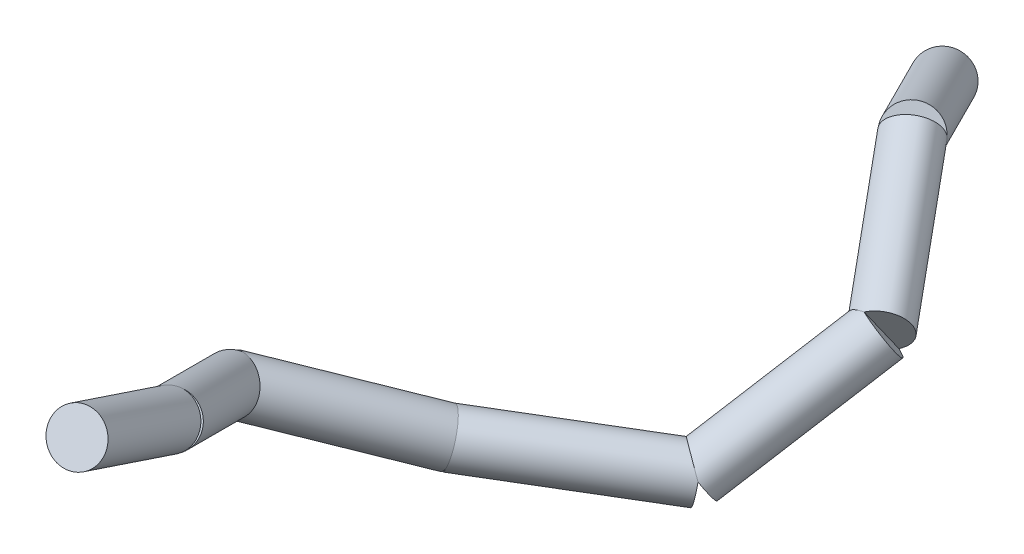
ISO-10303-21;
HEADER;
FILE_DESCRIPTION(('STEP AP214'),'2;1');
FILE_NAME('part.step','',(''),(''),'','','');
FILE_SCHEMA(('AUTOMOTIVE_DESIGN { 1 0 10303 214 1 1 1 1 }'));
ENDSEC;
DATA;
#1=APPLICATION_CONTEXT('core data for automotive mechanical design processes');
#2=APPLICATION_PROTOCOL_DEFINITION('international standard','automotive_design',2000,#1);
#3=PRODUCT_CONTEXT('',#1,'mechanical');
#4=PRODUCT('Part','Part','',(#3));
#5=PRODUCT_RELATED_PRODUCT_CATEGORY('part','',(#4));
#6=PRODUCT_DEFINITION_FORMATION('','',#4);
#7=PRODUCT_DEFINITION_CONTEXT('part definition',#1,'design');
#8=PRODUCT_DEFINITION('design','',#6,#7);
#9=PRODUCT_DEFINITION_SHAPE('','',#8);
#10=(LENGTH_UNIT() NAMED_UNIT(*) SI_UNIT(.MILLI.,.METRE.));
#11=(NAMED_UNIT(*) PLANE_ANGLE_UNIT() SI_UNIT($,.RADIAN.));
#12=(NAMED_UNIT(*) SI_UNIT($,.STERADIAN.) SOLID_ANGLE_UNIT());
#13=UNCERTAINTY_MEASURE_WITH_UNIT(LENGTH_MEASURE(1.E-05),#10,'distance_accuracy_value','');
#14=(GEOMETRIC_REPRESENTATION_CONTEXT(3) GLOBAL_UNCERTAINTY_ASSIGNED_CONTEXT((#13)) GLOBAL_UNIT_ASSIGNED_CONTEXT((#10,
#11,#12)) REPRESENTATION_CONTEXT('',''));
#15=CARTESIAN_POINT('',(0.,0.,0.));
#16=DIRECTION('',(0.,0.,1.));
#17=DIRECTION('',(1.,0.,0.));
#18=AXIS2_PLACEMENT_3D('',#15,#16,#17);
#19=CARTESIAN_POINT('',(0.,0.,0.));
#20=DIRECTION('',(0.557086014531156,0.371390676354103,0.742781352708207));
#21=DIRECTION('',(0.554700196225229,-0.832050294337844,0.));
#22=AXIS2_PLACEMENT_3D('',#19,#20,#21);
#23=PLANE('',#22);
#24=CARTESIAN_POINT('',(0.,0.,0.));
#25=DIRECTION('',(0.557086014531003,0.371390676354126,0.742781352708311));
#26=DIRECTION('',(0.821925551875018,-0.118716298750003,-0.557086014531012));
#27=AXIS2_PLACEMENT_3D('',#24,#25,#26);
#28=CIRCLE('',#27,8.);
#29=CARTESIAN_POINT('',(6.575404414999,-0.94973039,-4.456688116249));
#30=VERTEX_POINT('',#29);
#31=EDGE_CURVE('E10',#30,#30,#28,.T.);
#32=ORIENTED_EDGE('',*,*,#31,.F.);
#33=EDGE_LOOP('',(#32));
#34=FACE_BOUND('',#33,.T.);
#35=ADVANCED_FACE('F16',(#34),#23,.F.);
#36=CARTESIAN_POINT('',(30.,20.,40.));
#37=DIRECTION('',(0.557086014531156,0.371390676354103,0.742781352708207));
#38=DIRECTION('',(0.554700196225229,-0.832050294337844,0.));
#39=AXIS2_PLACEMENT_3D('',#36,#37,#38);
#40=PLANE('',#39);
#41=DIRECTION('',(0.8,0.,-0.6));
#42=VECTOR('',#41,1.);
#43=CARTESIAN_POINT('',(30.,20.,40.));
#44=LINE('',#43,#42);
#45=CARTESIAN_POINT('',(23.6,20.,44.8));
#46=VERTEX_POINT('',#45);
#47=CARTESIAN_POINT('',(36.4,20.,35.2));
#48=VERTEX_POINT('',#47);
#49=EDGE_CURVE('E208',#46,#48,#44,.T.);
#50=ORIENTED_EDGE('',*,*,#49,.T.);
#51=CARTESIAN_POINT('',(30.,20.,40.));
#52=DIRECTION('',(0.557086014531003,0.371390676354126,0.742781352708311));
#53=DIRECTION('',(0.821925551875018,-0.118716298750003,-0.557086014531012));
#54=AXIS2_PLACEMENT_3D('',#51,#52,#53);
#55=CIRCLE('',#54,8.);
#56=EDGE_CURVE('E42',#48,#46,#55,.T.);
#57=ORIENTED_EDGE('',*,*,#56,.T.);
#58=EDGE_LOOP('',(#50,#57));
#59=FACE_BOUND('',#58,.T.);
#60=ADVANCED_FACE('F318',(#59),#40,.T.);
#61=CARTESIAN_POINT('',(0.,0.,0.));
#62=DIRECTION('',(0.557086014531003,0.371390676354126,0.742781352708311));
#63=DIRECTION('',(0.821925551875018,-0.118716298750003,-0.557086014531012));
#64=AXIS2_PLACEMENT_3D('',#61,#62,#63);
#65=CYLINDRICAL_SURFACE('',#64,8.);
#66=ORIENTED_EDGE('',*,*,#56,.F.);
#67=CARTESIAN_POINT('',(30.,20.,40.));
#68=DIRECTION('',(0.6,0.,0.8));
#69=DIRECTION('',(0.,1.,0.));
#70=AXIS2_PLACEMENT_3D('',#67,#68,#69);
#71=ELLIPSE('',#70,8.616263691415,8.);
#72=CARTESIAN_POINT('',(36.347469121399,18.898312747599,35.23939815895));
#73=VERTEX_POINT('',#72);
#74=EDGE_CURVE('E180',#73,#48,#71,.T.);
#75=ORIENTED_EDGE('',*,*,#74,.F.);
#76=DIRECTION('',(0.557086014531156,0.371390676354103,0.742781352708207));
#77=VECTOR('',#76,1.);
#78=CARTESIAN_POINT('',(6.575404414999,-0.94973039,-4.456688116249));
#79=LINE('',#78,#77);
#80=EDGE_CURVE('E24',#30,#73,#79,.T.);
#81=ORIENTED_EDGE('',*,*,#80,.F.);
#82=ORIENTED_EDGE('',*,*,#31,.T.);
#83=ORIENTED_EDGE('',*,*,#80,.T.);
#84=CARTESIAN_POINT('',(30.,20.,40.));
#85=DIRECTION('',(0.6,0.,0.8));
#86=DIRECTION('',(0.,1.,0.));
#87=AXIS2_PLACEMENT_3D('',#84,#85,#86);
#88=ELLIPSE('',#87,8.616263691415,8.);
#89=EDGE_CURVE('E201',#46,#73,#88,.T.);
#90=ORIENTED_EDGE('',*,*,#89,.F.);
#91=EDGE_LOOP('',(#66,#75,#81,#82,#83,#90));
#92=FACE_BOUND('',#91,.T.);
#93=ADVANCED_FACE('F307',(#92),#65,.T.);
#94=CARTESIAN_POINT('',(30.,20.,40.));
#95=DIRECTION('',(0.557086014531156,-0.371390676354103,0.742781352708207));
#96=DIRECTION('',(-0.554700196225229,-0.832050294337844,0.));
#97=AXIS2_PLACEMENT_3D('',#94,#95,#96);
#98=PLANE('',#97);
#99=ORIENTED_EDGE('',*,*,#49,.F.);
#100=CARTESIAN_POINT('',(30.,20.,40.));
#101=DIRECTION('',(0.557086014531003,-0.371390676354126,0.742781352708311));
#102=DIRECTION('',(0.821925551875018,0.118716298750003,-0.557086014531012));
#103=AXIS2_PLACEMENT_3D('',#100,#101,#102);
#104=CIRCLE('',#103,8.);
#105=CARTESIAN_POINT('',(36.575404414999,20.94973039,35.543311883751));
#106=VERTEX_POINT('',#105);
#107=EDGE_CURVE('E204',#106,#46,#104,.T.);
#108=ORIENTED_EDGE('',*,*,#107,.F.);
#109=CARTESIAN_POINT('',(30.,20.,40.));
#110=DIRECTION('',(0.557086014531003,-0.371390676354126,0.742781352708311));
#111=DIRECTION('',(0.821925551875018,0.118716298750003,-0.557086014531012));
#112=AXIS2_PLACEMENT_3D('',#109,#110,#111);
#113=CIRCLE('',#112,8.);
#114=EDGE_CURVE('E176',#48,#106,#113,.T.);
#115=ORIENTED_EDGE('',*,*,#114,.F.);
#116=EDGE_LOOP('',(#99,#108,#115));
#117=FACE_BOUND('',#116,.T.);
#118=ADVANCED_FACE('F316',(#117),#98,.F.);
#119=CARTESIAN_POINT('',(60.,0.,80.));
#120=DIRECTION('',(0.557086014531156,-0.371390676354103,0.742781352708207));
#121=DIRECTION('',(-0.554700196225229,-0.832050294337844,0.));
#122=AXIS2_PLACEMENT_3D('',#119,#120,#121);
#123=PLANE('',#122);
#124=CARTESIAN_POINT('',(60.,0.,80.));
#125=DIRECTION('',(0.557086014531003,-0.371390676354126,0.742781352708311));
#126=DIRECTION('',(0.821925551875018,0.118716298750003,-0.557086014531012));
#127=AXIS2_PLACEMENT_3D('',#124,#125,#126);
#128=CIRCLE('',#127,8.);
#129=CARTESIAN_POINT('',(61.323037168951,-6.615185844758,75.700129200907));
#130=VERTEX_POINT('',#129);
#131=CARTESIAN_POINT('',(66.575404414999,0.94973039,75.543311883751));
#132=VERTEX_POINT('',#131);
#133=EDGE_CURVE('E179',#130,#132,#128,.T.);
#134=ORIENTED_EDGE('',*,*,#133,.T.);
#135=CARTESIAN_POINT('',(60.,0.,80.));
#136=DIRECTION('',(0.557086014531003,-0.371390676354126,0.742781352708311));
#137=DIRECTION('',(0.821925551875018,0.118716298750003,-0.557086014531012));
#138=AXIS2_PLACEMENT_3D('',#135,#136,#137);
#139=CIRCLE('',#138,8.);
#140=CARTESIAN_POINT('',(58.676962831049,6.615185844758,84.299870799093));
#141=VERTEX_POINT('',#140);
#142=EDGE_CURVE('E194',#132,#141,#139,.T.);
#143=ORIENTED_EDGE('',*,*,#142,.T.);
#144=DIRECTION('',(0.165379646118923,-0.826898230594612,-0.537483849886748));
#145=VECTOR('',#144,1.);
#146=CARTESIAN_POINT('',(60.,0.,80.));
#147=LINE('',#146,#145);
#148=EDGE_CURVE('E198',#141,#130,#147,.T.);
#149=ORIENTED_EDGE('',*,*,#148,.T.);
#150=EDGE_LOOP('',(#134,#143,#149));
#151=FACE_BOUND('',#150,.T.);
#152=ADVANCED_FACE('F339',(#151),#123,.T.);
#153=CARTESIAN_POINT('',(30.,20.,40.));
#154=DIRECTION('',(0.557086014531003,-0.371390676354126,0.742781352708311));
#155=DIRECTION('',(0.821925551875018,0.118716298750003,-0.557086014531012));
#156=AXIS2_PLACEMENT_3D('',#153,#154,#155);
#157=CYLINDRICAL_SURFACE('',#156,8.);
#158=ORIENTED_EDGE('',*,*,#142,.F.);
#159=DIRECTION('',(0.557086014531156,-0.371390676354103,0.742781352708207));
#160=VECTOR('',#159,1.);
#161=CARTESIAN_POINT('',(36.575404414999,20.94973039,35.543311883751));
#162=LINE('',#161,#160);
#163=EDGE_CURVE('E197',#106,#132,#162,.T.);
#164=ORIENTED_EDGE('',*,*,#163,.F.);
#165=ORIENTED_EDGE('',*,*,#107,.T.);
#166=ORIENTED_EDGE('',*,*,#89,.T.);
#167=ORIENTED_EDGE('',*,*,#74,.T.);
#168=ORIENTED_EDGE('',*,*,#114,.T.);
#169=ORIENTED_EDGE('',*,*,#163,.T.);
#170=ORIENTED_EDGE('',*,*,#133,.F.);
#171=CARTESIAN_POINT('',(60.,0.,80.));
#172=DIRECTION('',(0.105409255338843,-0.527046276694751,0.843274042711568));
#173=DIRECTION('',(0.980580675690959,0.196116135137992,0.));
#174=AXIS2_PLACEMENT_3D('',#171,#172,#173);
#175=ELLIPSE('',#174,9.082339395161,8.);
#176=EDGE_CURVE('E238',#141,#130,#175,.T.);
#177=ORIENTED_EDGE('',*,*,#176,.F.);
#178=EDGE_LOOP('',(#158,#164,#165,#166,#167,#168,#169,#170,#177));
#179=FACE_BOUND('',#178,.T.);
#180=ADVANCED_FACE('F310',(#179),#157,.T.);
#181=CARTESIAN_POINT('',(60.,0.,80.));
#182=DIRECTION('',(-0.371390676354103,-0.557086014531156,0.742781352708207));
#183=DIRECTION('',(-0.832050294337844,0.554700196225229,0.));
#184=AXIS2_PLACEMENT_3D('',#181,#182,#183);
#185=PLANE('',#184);
#186=ORIENTED_EDGE('',*,*,#148,.F.);
#187=CARTESIAN_POINT('',(60.,0.,80.));
#188=DIRECTION('',(-0.371390676354103,-0.557086014531156,0.742781352708207));
#189=DIRECTION('',(0.920855800833292,-0.118716298750038,0.371390676354117));
#190=AXIS2_PLACEMENT_3D('',#187,#188,#189);
#191=CIRCLE('',#190,8.);
#192=CARTESIAN_POINT('',(67.366846406666,-0.94973039,82.971125410833));
#193=VERTEX_POINT('',#192);
#194=EDGE_CURVE('E234',#193,#141,#191,.T.);
#195=ORIENTED_EDGE('',*,*,#194,.F.);
#196=CARTESIAN_POINT('',(60.,0.,80.));
#197=DIRECTION('',(-0.371390676354103,-0.557086014531156,0.742781352708207));
#198=DIRECTION('',(0.920855800833292,-0.118716298750038,0.371390676354117));
#199=AXIS2_PLACEMENT_3D('',#196,#197,#198);
#200=CIRCLE('',#199,8.);
#201=EDGE_CURVE('E284',#130,#193,#200,.T.);
#202=ORIENTED_EDGE('',*,*,#201,.F.);
#203=EDGE_LOOP('',(#186,#195,#202));
#204=FACE_BOUND('',#203,.T.);
#205=ADVANCED_FACE('F362',(#204),#185,.F.);
#206=CARTESIAN_POINT('',(40.,-30.,120.));
#207=DIRECTION('',(-0.371390676354103,-0.557086014531156,0.742781352708207));
#208=DIRECTION('',(-0.832050294337844,0.554700196225229,0.));
#209=AXIS2_PLACEMENT_3D('',#206,#207,#208);
#210=PLANE('',#209);
#211=CARTESIAN_POINT('',(40.,-30.,120.));
#212=DIRECTION('',(-0.371390676354103,-0.557086014531156,0.742781352708207));
#213=DIRECTION('',(0.920855800833292,-0.118716298750038,0.371390676354117));
#214=AXIS2_PLACEMENT_3D('',#211,#212,#213);
#215=CIRCLE('',#214,8.);
#216=CARTESIAN_POINT('',(34.365114199516,-32.81744290024,115.06947492457));
#217=VERTEX_POINT('',#216);
#218=CARTESIAN_POINT('',(47.366846406666,-30.94973039,122.97112541083));
#219=VERTEX_POINT('',#218);
#220=EDGE_CURVE('E287',#217,#219,#215,.T.);
#221=ORIENTED_EDGE('',*,*,#220,.T.);
#222=CARTESIAN_POINT('',(40.,-30.,120.));
#223=DIRECTION('',(-0.371390676354103,-0.557086014531156,0.742781352708207));
#224=DIRECTION('',(0.920855800833292,-0.118716298750038,0.371390676354117));
#225=AXIS2_PLACEMENT_3D('',#222,#223,#224);
#226=CIRCLE('',#225,8.);
#227=CARTESIAN_POINT('',(45.634885800484,-27.18255709975,124.93052507542));
#228=VERTEX_POINT('',#227);
#229=EDGE_CURVE('E213',#219,#228,#226,.T.);
#230=ORIENTED_EDGE('',*,*,#229,.T.);
#231=DIRECTION('',(-0.704360725060282,-0.352180362530141,-0.616315634428247));
#232=VECTOR('',#231,1.);
#233=CARTESIAN_POINT('',(40.,-30.,120.));
#234=LINE('',#233,#232);
#235=EDGE_CURVE('E217',#228,#217,#234,.T.);
#236=ORIENTED_EDGE('',*,*,#235,.T.);
#237=EDGE_LOOP('',(#221,#230,#236));
#238=FACE_BOUND('',#237,.T.);
#239=ADVANCED_FACE('F375',(#238),#210,.T.);
#240=CARTESIAN_POINT('',(0.,-20.,160.));
#241=DIRECTION('',(-0.696310623822761,0.17407765595594,0.696310623822761));
#242=DIRECTION('',(0.242535625036661,0.97014250014525,0.));
#243=AXIS2_PLACEMENT_3D('',#240,#241,#242);
#244=PLANE('',#243);
#245=DIRECTION('',(-0.529812942825842,0.529812942825842,-0.662266178532803));
#246=VECTOR('',#245,1.);
#247=CARTESIAN_POINT('',(0.,-20.,160.));
#248=LINE('',#247,#246);
#249=CARTESIAN_POINT('',(4.238503542608,-24.2385035426,165.29812942826));
#250=VERTEX_POINT('',#249);
#251=CARTESIAN_POINT('',(-4.238503542608,-15.76149645739,154.70187057174));
#252=VERTEX_POINT('',#251);
#253=EDGE_CURVE('E272',#250,#252,#248,.T.);
#254=ORIENTED_EDGE('',*,*,#253,.T.);
#255=CARTESIAN_POINT('',(0.,-20.,160.));
#256=DIRECTION('',(-0.696310623823072,0.174077655955909,0.696310623822458));
#257=DIRECTION('',(0.714174704774096,0.0714563238064096,0.696310623823094));
#258=AXIS2_PLACEMENT_3D('',#255,#256,#257);
#259=CIRCLE('',#258,8.);
#260=EDGE_CURVE('E260',#252,#250,#259,.T.);
#261=ORIENTED_EDGE('',*,*,#260,.T.);
#262=EDGE_LOOP('',(#254,#261));
#263=FACE_BOUND('',#262,.T.);
#264=ADVANCED_FACE('F372',(#263),#244,.T.);
#265=CARTESIAN_POINT('',(60.,0.,80.));
#266=DIRECTION('',(-0.371390676354103,-0.557086014531156,0.742781352708207));
#267=DIRECTION('',(0.920855800833292,-0.118716298750038,0.371390676354117));
#268=AXIS2_PLACEMENT_3D('',#265,#266,#267);
#269=CYLINDRICAL_SURFACE('',#268,8.);
#270=ORIENTED_EDGE('',*,*,#229,.F.);
#271=DIRECTION('',(-0.371390676354103,-0.557086014531156,0.742781352708207));
#272=VECTOR('',#271,1.);
#273=CARTESIAN_POINT('',(67.366846406666,-0.94973039,82.971125410833));
#274=LINE('',#273,#272);
#275=EDGE_CURVE('E216',#193,#219,#274,.T.);
#276=ORIENTED_EDGE('',*,*,#275,.F.);
#277=ORIENTED_EDGE('',*,*,#194,.T.);
#278=ORIENTED_EDGE('',*,*,#176,.T.);
#279=ORIENTED_EDGE('',*,*,#201,.T.);
#280=ORIENTED_EDGE('',*,*,#275,.T.);
#281=ORIENTED_EDGE('',*,*,#220,.F.);
#282=CARTESIAN_POINT('',(40.,-30.,120.));
#283=DIRECTION('',(-0.582681122737445,-0.209020762975386,0.785361719114586));
#284=DIRECTION('',(0.405411739097143,-0.91229343573932,0.0579828328833403));
#285=AXIS2_PLACEMENT_3D('',#282,#283,#284);
#286=ELLIPSE('',#285,8.731747317585,8.);
#287=EDGE_CURVE('E268',#228,#217,#286,.T.);
#288=ORIENTED_EDGE('',*,*,#287,.F.);
#289=EDGE_LOOP('',(#270,#276,#277,#278,#279,#280,#281,#288));
#290=FACE_BOUND('',#289,.T.);
#291=ADVANCED_FACE('F370',(#290),#269,.T.);
#292=CARTESIAN_POINT('',(40.,-30.,120.));
#293=DIRECTION('',(-0.696310623822761,0.17407765595594,0.696310623822761));
#294=DIRECTION('',(0.242535625036661,0.97014250014525,0.));
#295=AXIS2_PLACEMENT_3D('',#292,#293,#294);
#296=PLANE('',#295);
#297=ORIENTED_EDGE('',*,*,#235,.F.);
#298=CARTESIAN_POINT('',(40.,-30.,120.));
#299=DIRECTION('',(-0.696310623823072,0.174077655955909,0.696310623822458));
#300=DIRECTION('',(0.714174704774096,0.0714563238064096,0.696310623823094));
#301=AXIS2_PLACEMENT_3D('',#298,#299,#300);
#302=CIRCLE('',#301,8.);
#303=CARTESIAN_POINT('',(45.713397638195,-29.42834940954,125.57048499058));
#304=VERTEX_POINT('',#303);
#305=EDGE_CURVE('E264',#304,#228,#302,.T.);
#306=ORIENTED_EDGE('',*,*,#305,.F.);
#307=CARTESIAN_POINT('',(40.,-30.,120.));
#308=DIRECTION('',(-0.696310623823072,0.174077655955909,0.696310623822458));
#309=DIRECTION('',(0.714174704774096,0.0714563238064096,0.696310623823094));
#310=AXIS2_PLACEMENT_3D('',#307,#308,#309);
#311=CIRCLE('',#310,8.);
#312=EDGE_CURVE('E253',#217,#304,#311,.T.);
#313=ORIENTED_EDGE('',*,*,#312,.F.);
#314=EDGE_LOOP('',(#297,#306,#313));
#315=FACE_BOUND('',#314,.T.);
#316=ADVANCED_FACE('F367',(#315),#296,.F.);
#317=CARTESIAN_POINT('',(-30.,0.,200.));
#318=DIRECTION('',(-0.557086014531156,0.371390676354103,0.742781352708207));
#319=DIRECTION('',(0.554700196225229,0.832050294337844,0.));
#320=AXIS2_PLACEMENT_3D('',#317,#318,#319);
#321=PLANE('',#320);
#322=DIRECTION('',(0.,0.894427190999916,-0.447213595499958));
#323=VECTOR('',#322,1.);
#324=CARTESIAN_POINT('',(-30.,0.,200.));
#325=LINE('',#324,#323);
#326=CARTESIAN_POINT('',(-30.,-7.155417527999,203.577708764));
#327=VERTEX_POINT('',#326);
#328=CARTESIAN_POINT('',(-30.,7.155417527999,196.422291236));
#329=VERTEX_POINT('',#328);
#330=EDGE_CURVE('E250',#327,#329,#325,.T.);
#331=ORIENTED_EDGE('',*,*,#330,.T.);
#332=CARTESIAN_POINT('',(-30.,0.,200.));
#333=DIRECTION('',(-0.557086014531003,0.371390676354126,0.742781352708311));
#334=DIRECTION('',(0.821925551875018,0.118716298750003,0.557086014531012));
#335=AXIS2_PLACEMENT_3D('',#332,#333,#334);
#336=CIRCLE('',#335,8.);
#337=EDGE_CURVE('E229',#329,#327,#336,.T.);
#338=ORIENTED_EDGE('',*,*,#337,.T.);
#339=EDGE_LOOP('',(#331,#338));
#340=FACE_BOUND('',#339,.T.);
#341=ADVANCED_FACE('F365',(#340),#321,.T.);
#342=CARTESIAN_POINT('',(0.,-20.,160.));
#343=DIRECTION('',(-0.557086014531156,0.371390676354103,0.742781352708207));
#344=DIRECTION('',(0.554700196225229,0.832050294337844,0.));
#345=AXIS2_PLACEMENT_3D('',#342,#343,#344);
#346=PLANE('',#345);
#347=CARTESIAN_POINT('',(0.,-20.,160.));
#348=DIRECTION('',(-0.557086014531003,0.371390676354126,0.742781352708311));
#349=DIRECTION('',(0.821925551875018,0.118716298750003,0.557086014531012));
#350=AXIS2_PLACEMENT_3D('',#347,#348,#349);
#351=CIRCLE('',#350,8.);
#352=EDGE_CURVE('E242',#252,#250,#351,.T.);
#353=ORIENTED_EDGE('',*,*,#352,.F.);
#354=ORIENTED_EDGE('',*,*,#253,.F.);
#355=EDGE_LOOP('',(#353,#354));
#356=FACE_BOUND('',#355,.T.);
#357=ADVANCED_FACE('F352',(#356),#346,.F.);
#358=CARTESIAN_POINT('',(40.,-30.,120.));
#359=DIRECTION('',(-0.696310623823072,0.174077655955909,0.696310623822458));
#360=DIRECTION('',(0.714174704774096,0.0714563238064096,0.696310623823094));
#361=AXIS2_PLACEMENT_3D('',#358,#359,#360);
#362=CYLINDRICAL_SURFACE('',#361,8.);
#363=ORIENTED_EDGE('',*,*,#312,.T.);
#364=DIRECTION('',(-0.696310623822761,0.17407765595594,0.696310623822761));
#365=VECTOR('',#364,1.);
#366=CARTESIAN_POINT('',(45.713397638195,-29.42834940954,125.57048499058));
#367=LINE('',#366,#365);
#368=CARTESIAN_POINT('',(6.125968755598,-19.5314921889,165.15791387317));
#369=VERTEX_POINT('',#368);
#370=EDGE_CURVE('E257',#304,#369,#367,.T.);
#371=ORIENTED_EDGE('',*,*,#370,.T.);
#372=CARTESIAN_POINT('',(0.,-20.,160.));
#373=DIRECTION('',(-0.631490206814066,0.274819557863985,0.725047811743041));
#374=DIRECTION('',(-0.566143413201724,-0.802354320876608,-0.188968726139908));
#375=AXIS2_PLACEMENT_3D('',#372,#373,#374);
#376=ELLIPSE('',#375,8.061169944015,8.);
#377=EDGE_CURVE('E246',#250,#369,#376,.T.);
#378=ORIENTED_EDGE('',*,*,#377,.F.);
#379=ORIENTED_EDGE('',*,*,#260,.F.);
#380=CARTESIAN_POINT('',(0.,-20.,160.));
#381=DIRECTION('',(-0.631490206814066,0.274819557863985,0.725047811743041));
#382=DIRECTION('',(-0.566143413201724,-0.802354320876608,-0.188968726139908));
#383=AXIS2_PLACEMENT_3D('',#380,#381,#382);
#384=ELLIPSE('',#383,8.061169944015,8.);
#385=CARTESIAN_POINT('',(6.204923573545,-18.80328238236,164.95066257152));
#386=VERTEX_POINT('',#385);
#387=EDGE_CURVE('E233',#386,#252,#384,.T.);
#388=ORIENTED_EDGE('',*,*,#387,.F.);
#389=CARTESIAN_POINT('',(0.,-20.,160.));
#390=DIRECTION('',(-0.631490206814066,0.274819557863985,0.725047811743041));
#391=DIRECTION('',(-0.566143413201724,-0.802354320876608,-0.188968726139908));
#392=AXIS2_PLACEMENT_3D('',#389,#390,#391);
#393=ELLIPSE('',#392,8.061169944015,8.);
#394=EDGE_CURVE('E171',#369,#386,#393,.T.);
#395=ORIENTED_EDGE('',*,*,#394,.F.);
#396=ORIENTED_EDGE('',*,*,#370,.F.);
#397=ORIENTED_EDGE('',*,*,#305,.T.);
#398=ORIENTED_EDGE('',*,*,#287,.T.);
#399=EDGE_LOOP('',(#363,#371,#378,#379,#388,#395,#396,#397,#398));
#400=FACE_BOUND('',#399,.T.);
#401=ADVANCED_FACE('F348',(#400),#362,.T.);
#402=CARTESIAN_POINT('',(-30.,0.,200.));
#403=DIRECTION('',(0.408248290463863,0.408248290463863,0.816496580927726));
#404=DIRECTION('',(0.707106781186548,-0.707106781186548,0.));
#405=AXIS2_PLACEMENT_3D('',#402,#403,#404);
#406=PLANE('',#405);
#407=CARTESIAN_POINT('',(-30.,0.,200.));
#408=DIRECTION('',(0.408248290463915,0.408248290463858,0.816496580927703));
#409=DIRECTION('',(0.908248290463836,-0.0917517095361234,-0.408248290463927));
#410=AXIS2_PLACEMENT_3D('',#407,#408,#409);
#411=CIRCLE('',#410,8.);
#412=EDGE_CURVE('E183',#329,#327,#411,.T.);
#413=ORIENTED_EDGE('',*,*,#412,.F.);
#414=ORIENTED_EDGE('',*,*,#330,.F.);
#415=EDGE_LOOP('',(#413,#414));
#416=FACE_BOUND('',#415,.T.);
#417=ADVANCED_FACE('F351',(#416),#406,.F.);
#418=CARTESIAN_POINT('',(0.,-20.,160.));
#419=DIRECTION('',(-0.557086014531003,0.371390676354126,0.742781352708311));
#420=DIRECTION('',(0.821925551875018,0.118716298750003,0.557086014531012));
#421=AXIS2_PLACEMENT_3D('',#418,#419,#420);
#422=CYLINDRICAL_SURFACE('',#421,8.);
#423=ORIENTED_EDGE('',*,*,#394,.T.);
#424=DIRECTION('',(-0.557086014531156,0.371390676354103,0.742781352708207));
#425=VECTOR('',#424,1.);
#426=CARTESIAN_POINT('',(6.575404414999,-19.05026961,164.45668811624));
#427=LINE('',#426,#425);
#428=CARTESIAN_POINT('',(-20.98213296274,-0.678578024835,201.20007128657));
#429=VERTEX_POINT('',#428);
#430=EDGE_CURVE('E174',#386,#429,#427,.T.);
#431=ORIENTED_EDGE('',*,*,#430,.T.);
#432=CARTESIAN_POINT('',(-30.,0.,200.));
#433=DIRECTION('',(-0.0850662781230487,0.445592578107964,0.891185156216928));
#434=DIRECTION('',(-0.996375294919686,-0.038042796095208,-0.0760855921904161));
#435=AXIS2_PLACEMENT_3D('',#432,#433,#434);
#436=ELLIPSE('',#435,9.14459327095,8.);
#437=EDGE_CURVE('E175',#327,#429,#436,.T.);
#438=ORIENTED_EDGE('',*,*,#437,.F.);
#439=ORIENTED_EDGE('',*,*,#337,.F.);
#440=CARTESIAN_POINT('',(-30.,0.,200.));
#441=DIRECTION('',(-0.0850662781230487,0.445592578107964,0.891185156216928));
#442=DIRECTION('',(-0.996375294919686,-0.038042796095208,-0.0760855921904161));
#443=AXIS2_PLACEMENT_3D('',#440,#441,#442);
#444=ELLIPSE('',#443,9.14459327095,8.);
#445=CARTESIAN_POINT('',(-20.93469215532,1.065307844679,200.33265671822));
#446=VERTEX_POINT('',#445);
#447=EDGE_CURVE('E220',#446,#329,#444,.T.);
#448=ORIENTED_EDGE('',*,*,#447,.F.);
#449=CARTESIAN_POINT('',(-30.,0.,200.));
#450=DIRECTION('',(-0.0850662781230487,0.445592578107964,0.891185156216928));
#451=DIRECTION('',(-0.996375294919686,-0.038042796095208,-0.0760855921904161));
#452=AXIS2_PLACEMENT_3D('',#449,#450,#451);
#453=ELLIPSE('',#452,9.14459327095,8.);
#454=EDGE_CURVE('E189',#429,#446,#453,.T.);
#455=ORIENTED_EDGE('',*,*,#454,.F.);
#456=ORIENTED_EDGE('',*,*,#430,.F.);
#457=ORIENTED_EDGE('',*,*,#387,.T.);
#458=ORIENTED_EDGE('',*,*,#352,.T.);
#459=ORIENTED_EDGE('',*,*,#377,.T.);
#460=EDGE_LOOP('',(#423,#431,#438,#439,#448,#455,#456,#457,#458,#459));
#461=FACE_BOUND('',#460,.T.);
#462=ADVANCED_FACE('F346',(#461),#422,.T.);
#463=CARTESIAN_POINT('',(-10.,20.,240.));
#464=DIRECTION('',(0.408248290463863,0.408248290463863,0.816496580927726));
#465=DIRECTION('',(0.707106781186548,-0.707106781186548,0.));
#466=AXIS2_PLACEMENT_3D('',#463,#464,#465);
#467=PLANE('',#466);
#468=CARTESIAN_POINT('',(-10.,20.,240.));
#469=DIRECTION('',(0.408248290463915,0.408248290463858,0.816496580927703));
#470=DIRECTION('',(0.908248290463836,-0.0917517095361234,-0.408248290463927));
#471=AXIS2_PLACEMENT_3D('',#468,#469,#470);
#472=CIRCLE('',#471,8.);
#473=CARTESIAN_POINT('',(-10.,12.844582472001,243.577708764));
#474=VERTEX_POINT('',#473);
#475=CARTESIAN_POINT('',(-2.734013676289,19.265986323711,236.73401367628));
#476=VERTEX_POINT('',#475);
#477=EDGE_CURVE('E188',#474,#476,#472,.T.);
#478=ORIENTED_EDGE('',*,*,#477,.T.);
#479=CARTESIAN_POINT('',(-10.,20.,240.));
#480=DIRECTION('',(0.408248290463915,0.408248290463858,0.816496580927703));
#481=DIRECTION('',(0.908248290463836,-0.0917517095361234,-0.408248290463927));
#482=AXIS2_PLACEMENT_3D('',#479,#480,#481);
#483=CIRCLE('',#482,8.);
#484=CARTESIAN_POINT('',(-10.,27.155417527999,236.422291236));
#485=VERTEX_POINT('',#484);
#486=EDGE_CURVE('E212',#476,#485,#483,.T.);
#487=ORIENTED_EDGE('',*,*,#486,.T.);
#488=DIRECTION('',(0.,-0.894427190999916,0.447213595499958));
#489=VECTOR('',#488,1.);
#490=CARTESIAN_POINT('',(-10.,20.,240.));
#491=LINE('',#490,#489);
#492=EDGE_CURVE('E154',#485,#474,#491,.T.);
#493=ORIENTED_EDGE('',*,*,#492,.T.);
#494=EDGE_LOOP('',(#478,#487,#493));
#495=FACE_BOUND('',#494,.T.);
#496=ADVANCED_FACE('F342',(#495),#467,.T.);
#497=CARTESIAN_POINT('',(0.,40.,280.));
#498=DIRECTION('',(0.218217890235993,0.436435780471985,0.87287156094397));
#499=DIRECTION('',(0.894427190999916,-0.447213595499958,0.));
#500=AXIS2_PLACEMENT_3D('',#497,#498,#499);
#501=PLANE('',#500);
#502=CARTESIAN_POINT('',(0.,40.,280.));
#503=DIRECTION('',(0.218217890235954,0.436435780471987,0.872871560943978));
#504=DIRECTION('',(0.974574312188803,-0.0508513756223997,-0.218217890235956));
#505=AXIS2_PLACEMENT_3D('',#502,#503,#504);
#506=CIRCLE('',#505,8.);
#507=CARTESIAN_POINT('',(7.79659449751,39.593188995021,278.25425687811));
#508=VERTEX_POINT('',#507);
#509=EDGE_CURVE('E160',#508,#508,#506,.T.);
#510=ORIENTED_EDGE('',*,*,#509,.T.);
#511=EDGE_LOOP('',(#510));
#512=FACE_BOUND('',#511,.T.);
#513=ADVANCED_FACE('F335',(#512),#501,.T.);
#514=CARTESIAN_POINT('',(-30.,0.,200.));
#515=DIRECTION('',(0.408248290463915,0.408248290463858,0.816496580927703));
#516=DIRECTION('',(0.908248290463836,-0.0917517095361234,-0.408248290463927));
#517=AXIS2_PLACEMENT_3D('',#514,#515,#516);
#518=CYLINDRICAL_SURFACE('',#517,8.);
#519=ORIENTED_EDGE('',*,*,#454,.T.);
#520=DIRECTION('',(0.408248290463863,0.408248290463863,0.816496580927726));
#521=VECTOR('',#520,1.);
#522=CARTESIAN_POINT('',(-22.73401367628,-0.734013676289,196.73401367628));
#523=LINE('',#522,#521);
#524=EDGE_CURVE('E185',#446,#476,#523,.T.);
#525=ORIENTED_EDGE('',*,*,#524,.T.);
#526=ORIENTED_EDGE('',*,*,#477,.F.);
#527=CARTESIAN_POINT('',(-10.,20.,240.));
#528=DIRECTION('',(0.314814448733296,0.424474230753071,0.84894846150714));
#529=DIRECTION('',(0.949153234661691,-0.140789301532954,-0.281578603066908));
#530=AXIS2_PLACEMENT_3D('',#527,#528,#529);
#531=ELLIPSE('',#530,8.040388028782,8.);
#532=EDGE_CURVE('E150',#485,#474,#531,.T.);
#533=ORIENTED_EDGE('',*,*,#532,.F.);
#534=ORIENTED_EDGE('',*,*,#486,.F.);
#535=ORIENTED_EDGE('',*,*,#524,.F.);
#536=ORIENTED_EDGE('',*,*,#447,.T.);
#537=ORIENTED_EDGE('',*,*,#412,.T.);
#538=ORIENTED_EDGE('',*,*,#437,.T.);
#539=EDGE_LOOP('',(#519,#525,#526,#533,#534,#535,#536,#537,#538));
#540=FACE_BOUND('',#539,.T.);
#541=ADVANCED_FACE('F332',(#540),#518,.T.);
#542=CARTESIAN_POINT('',(-10.,20.,240.));
#543=DIRECTION('',(0.218217890235993,0.436435780471985,0.87287156094397));
#544=DIRECTION('',(0.894427190999916,-0.447213595499958,0.));
#545=AXIS2_PLACEMENT_3D('',#542,#543,#544);
#546=PLANE('',#545);
#547=ORIENTED_EDGE('',*,*,#492,.F.);
#548=CARTESIAN_POINT('',(-10.,20.,240.));
#549=DIRECTION('',(0.218217890235954,0.436435780471987,0.872871560943978));
#550=DIRECTION('',(0.974574312188803,-0.0508513756223997,-0.218217890235956));
#551=AXIS2_PLACEMENT_3D('',#548,#549,#550);
#552=CIRCLE('',#551,8.);
#553=CARTESIAN_POINT('',(-2.20340550249,19.593188995021,238.25425687811));
#554=VERTEX_POINT('',#553);
#555=EDGE_CURVE('E156',#554,#485,#552,.T.);
#556=ORIENTED_EDGE('',*,*,#555,.F.);
#557=CARTESIAN_POINT('',(-10.,20.,240.));
#558=DIRECTION('',(0.218217890235954,0.436435780471987,0.872871560943978));
#559=DIRECTION('',(0.974574312188803,-0.0508513756223997,-0.218217890235956));
#560=AXIS2_PLACEMENT_3D('',#557,#558,#559);
#561=CIRCLE('',#560,8.);
#562=EDGE_CURVE('E142',#474,#554,#561,.T.);
#563=ORIENTED_EDGE('',*,*,#562,.F.);
#564=EDGE_LOOP('',(#547,#556,#563));
#565=FACE_BOUND('',#564,.T.);
#566=ADVANCED_FACE('F157',(#565),#546,.F.);
#567=CARTESIAN_POINT('',(-10.,20.,240.));
#568=DIRECTION('',(0.218217890235954,0.436435780471987,0.872871560943978));
#569=DIRECTION('',(0.974574312188803,-0.0508513756223997,-0.218217890235956));
#570=AXIS2_PLACEMENT_3D('',#567,#568,#569);
#571=CYLINDRICAL_SURFACE('',#570,8.);
#572=DIRECTION('',(0.218217890235993,0.436435780471985,0.87287156094397));
#573=VECTOR('',#572,1.);
#574=CARTESIAN_POINT('',(-2.20340550249,19.593188995021,238.25425687811));
#575=LINE('',#574,#573);
#576=EDGE_CURVE('E147',#554,#508,#575,.T.);
#577=ORIENTED_EDGE('',*,*,#576,.T.);
#578=ORIENTED_EDGE('',*,*,#509,.F.);
#579=ORIENTED_EDGE('',*,*,#576,.F.);
#580=ORIENTED_EDGE('',*,*,#555,.T.);
#581=ORIENTED_EDGE('',*,*,#532,.T.);
#582=ORIENTED_EDGE('',*,*,#562,.T.);
#583=EDGE_LOOP('',(#577,#578,#579,#580,#581,#582));
#584=FACE_BOUND('',#583,.T.);
#585=ADVANCED_FACE('F144',(#584),#571,.T.);
#586=CLOSED_SHELL('',(#35,#60,#93,#118,#152,#180,#205,#239,#264,#291,#316,#341,#357,#401,#417,
#462,#496,#513,#541,#566,#585));
#587=MANIFOLD_SOLID_BREP('B1',#586);
#588=ADVANCED_BREP_SHAPE_REPRESENTATION('',(#18,#587),#14);
#589=SHAPE_DEFINITION_REPRESENTATION(#9,#588);
ENDSEC;
END-ISO-10303-21;
